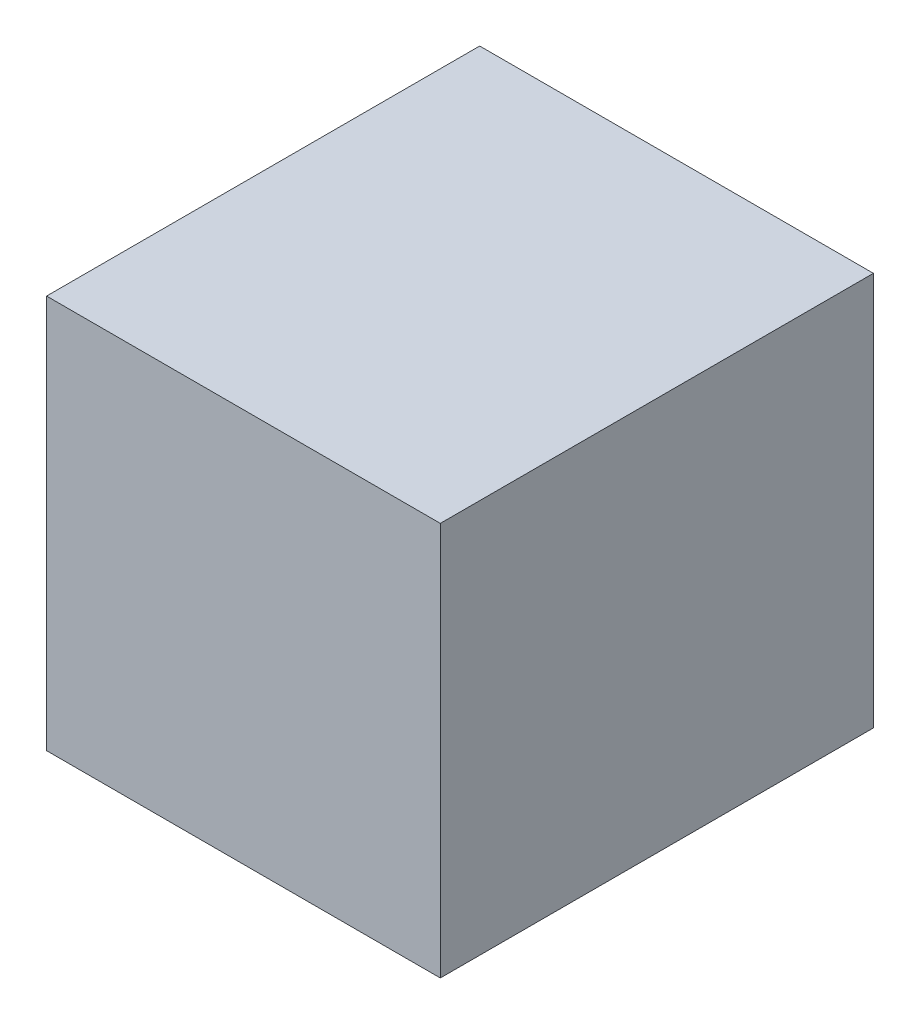
ISO-10303-21;
HEADER;
FILE_DESCRIPTION(('STEP AP214'),'2;1');
FILE_NAME('part.step','',(''),(''),'','','');
FILE_SCHEMA(('AUTOMOTIVE_DESIGN { 1 0 10303 214 1 1 1 1 }'));
ENDSEC;
DATA;
#1=APPLICATION_CONTEXT('core data for automotive mechanical design processes');
#2=APPLICATION_PROTOCOL_DEFINITION('international standard','automotive_design',2000,#1);
#3=PRODUCT_CONTEXT('',#1,'mechanical');
#4=PRODUCT('Part','Part','',(#3));
#5=PRODUCT_RELATED_PRODUCT_CATEGORY('part','',(#4));
#6=PRODUCT_DEFINITION_FORMATION('','',#4);
#7=PRODUCT_DEFINITION_CONTEXT('part definition',#1,'design');
#8=PRODUCT_DEFINITION('design','',#6,#7);
#9=PRODUCT_DEFINITION_SHAPE('','',#8);
#10=(LENGTH_UNIT() NAMED_UNIT(*) SI_UNIT(.MILLI.,.METRE.));
#11=(NAMED_UNIT(*) PLANE_ANGLE_UNIT() SI_UNIT($,.RADIAN.));
#12=(NAMED_UNIT(*) SI_UNIT($,.STERADIAN.) SOLID_ANGLE_UNIT());
#13=UNCERTAINTY_MEASURE_WITH_UNIT(LENGTH_MEASURE(1.E-05),#10,'distance_accuracy_value','');
#14=(GEOMETRIC_REPRESENTATION_CONTEXT(3) GLOBAL_UNCERTAINTY_ASSIGNED_CONTEXT((#13)) GLOBAL_UNIT_ASSIGNED_CONTEXT((#10,
#11,#12)) REPRESENTATION_CONTEXT('',''));
#15=CARTESIAN_POINT('',(0.,0.,0.));
#16=DIRECTION('',(0.,0.,1.));
#17=DIRECTION('',(1.,0.,0.));
#18=AXIS2_PLACEMENT_3D('',#15,#16,#17);
#19=CARTESIAN_POINT('',(200.,180.,-248.));
#20=DIRECTION('',(-1.,0.,0.));
#21=DIRECTION('',(0.,0.,1.));
#22=AXIS2_PLACEMENT_3D('',#19,#20,#21);
#23=PLANE('',#22);
#24=DIRECTION('',(0.,-1.,0.));
#25=VECTOR('',#24,1.);
#26=CARTESIAN_POINT('',(200.,180.,-138.));
#27=LINE('',#26,#25);
#28=CARTESIAN_POINT('',(200.,280.,-138.));
#29=VERTEX_POINT('',#28);
#30=CARTESIAN_POINT('',(200.,180.,-138.));
#31=VERTEX_POINT('',#30);
#32=EDGE_CURVE('E103',#29,#31,#27,.T.);
#33=ORIENTED_EDGE('',*,*,#32,.F.);
#34=DIRECTION('',(0.,0.,1.));
#35=VECTOR('',#34,1.);
#36=CARTESIAN_POINT('',(200.,280.,-248.));
#37=LINE('',#36,#35);
#38=CARTESIAN_POINT('',(200.,280.,-248.));
#39=VERTEX_POINT('',#38);
#40=EDGE_CURVE('E11',#39,#29,#37,.T.);
#41=ORIENTED_EDGE('',*,*,#40,.F.);
#42=DIRECTION('',(0.,-1.,0.));
#43=VECTOR('',#42,1.);
#44=CARTESIAN_POINT('',(200.,180.,-248.));
#45=LINE('',#44,#43);
#46=CARTESIAN_POINT('',(200.,180.,-248.));
#47=VERTEX_POINT('',#46);
#48=EDGE_CURVE('E97',#39,#47,#45,.T.);
#49=ORIENTED_EDGE('',*,*,#48,.T.);
#50=DIRECTION('',(0.,0.,1.));
#51=VECTOR('',#50,1.);
#52=CARTESIAN_POINT('',(200.,180.,-248.));
#53=LINE('',#52,#51);
#54=EDGE_CURVE('E42',#47,#31,#53,.T.);
#55=ORIENTED_EDGE('',*,*,#54,.T.);
#56=EDGE_LOOP('',(#33,#41,#49,#55));
#57=FACE_BOUND('',#56,.T.);
#58=ADVANCED_FACE('F39',(#57),#23,.T.);
#59=CARTESIAN_POINT('',(200.,280.,-248.));
#60=DIRECTION('',(0.,1.,0.));
#61=DIRECTION('',(0.,0.,1.));
#62=AXIS2_PLACEMENT_3D('',#59,#60,#61);
#63=PLANE('',#62);
#64=DIRECTION('',(-1.,0.,0.));
#65=VECTOR('',#64,1.);
#66=CARTESIAN_POINT('',(200.,280.,-138.));
#67=LINE('',#66,#65);
#68=CARTESIAN_POINT('',(300.,280.,-138.));
#69=VERTEX_POINT('',#68);
#70=EDGE_CURVE('E99',#69,#29,#67,.T.);
#71=ORIENTED_EDGE('',*,*,#70,.F.);
#72=DIRECTION('',(0.,0.,1.));
#73=VECTOR('',#72,1.);
#74=CARTESIAN_POINT('',(300.,280.,-248.));
#75=LINE('',#74,#73);
#76=CARTESIAN_POINT('',(300.,280.,-248.));
#77=VERTEX_POINT('',#76);
#78=EDGE_CURVE('E48',#77,#69,#75,.T.);
#79=ORIENTED_EDGE('',*,*,#78,.F.);
#80=DIRECTION('',(-1.,0.,0.));
#81=VECTOR('',#80,1.);
#82=CARTESIAN_POINT('',(200.,280.,-248.));
#83=LINE('',#82,#81);
#84=EDGE_CURVE('E94',#77,#39,#83,.T.);
#85=ORIENTED_EDGE('',*,*,#84,.T.);
#86=ORIENTED_EDGE('',*,*,#40,.T.);
#87=EDGE_LOOP('',(#71,#79,#85,#86));
#88=FACE_BOUND('',#87,.T.);
#89=ADVANCED_FACE('F113',(#88),#63,.T.);
#90=CARTESIAN_POINT('',(300.,180.,-248.));
#91=DIRECTION('',(1.,0.,0.));
#92=DIRECTION('',(0.,0.,-1.));
#93=AXIS2_PLACEMENT_3D('',#90,#91,#92);
#94=PLANE('',#93);
#95=DIRECTION('',(0.,1.,0.));
#96=VECTOR('',#95,1.);
#97=CARTESIAN_POINT('',(300.,180.,-138.));
#98=LINE('',#97,#96);
#99=CARTESIAN_POINT('',(300.,180.,-138.));
#100=VERTEX_POINT('',#99);
#101=EDGE_CURVE('E89',#100,#69,#98,.T.);
#102=ORIENTED_EDGE('',*,*,#101,.F.);
#103=DIRECTION('',(0.,0.,1.));
#104=VECTOR('',#103,1.);
#105=CARTESIAN_POINT('',(300.,180.,-248.));
#106=LINE('',#105,#104);
#107=CARTESIAN_POINT('',(300.,180.,-248.));
#108=VERTEX_POINT('',#107);
#109=EDGE_CURVE('E84',#108,#100,#106,.T.);
#110=ORIENTED_EDGE('',*,*,#109,.F.);
#111=DIRECTION('',(0.,1.,0.));
#112=VECTOR('',#111,1.);
#113=CARTESIAN_POINT('',(300.,180.,-248.));
#114=LINE('',#113,#112);
#115=EDGE_CURVE('E87',#108,#77,#114,.T.);
#116=ORIENTED_EDGE('',*,*,#115,.T.);
#117=ORIENTED_EDGE('',*,*,#78,.T.);
#118=EDGE_LOOP('',(#102,#110,#116,#117));
#119=FACE_BOUND('',#118,.T.);
#120=ADVANCED_FACE('F86',(#119),#94,.T.);
#121=CARTESIAN_POINT('',(200.,180.,-248.));
#122=DIRECTION('',(0.,-1.,0.));
#123=DIRECTION('',(0.,0.,-1.));
#124=AXIS2_PLACEMENT_3D('',#121,#122,#123);
#125=PLANE('',#124);
#126=DIRECTION('',(1.,0.,0.));
#127=VECTOR('',#126,1.);
#128=CARTESIAN_POINT('',(200.,180.,-138.));
#129=LINE('',#128,#127);
#130=EDGE_CURVE('E106',#31,#100,#129,.T.);
#131=ORIENTED_EDGE('',*,*,#130,.F.);
#132=ORIENTED_EDGE('',*,*,#54,.F.);
#133=DIRECTION('',(1.,0.,0.));
#134=VECTOR('',#133,1.);
#135=CARTESIAN_POINT('',(200.,180.,-248.));
#136=LINE('',#135,#134);
#137=EDGE_CURVE('E93',#47,#108,#136,.T.);
#138=ORIENTED_EDGE('',*,*,#137,.T.);
#139=ORIENTED_EDGE('',*,*,#109,.T.);
#140=EDGE_LOOP('',(#131,#132,#138,#139));
#141=FACE_BOUND('',#140,.T.);
#142=ADVANCED_FACE('F96',(#141),#125,.T.);
#143=CARTESIAN_POINT('',(0.,0.,-248.));
#144=DIRECTION('',(0.,0.,-1.));
#145=DIRECTION('',(-1.,0.,0.));
#146=AXIS2_PLACEMENT_3D('',#143,#144,#145);
#147=PLANE('',#146);
#148=ORIENTED_EDGE('',*,*,#48,.F.);
#149=ORIENTED_EDGE('',*,*,#84,.F.);
#150=ORIENTED_EDGE('',*,*,#115,.F.);
#151=ORIENTED_EDGE('',*,*,#137,.F.);
#152=EDGE_LOOP('',(#148,#149,#150,#151));
#153=FACE_BOUND('',#152,.T.);
#154=ADVANCED_FACE('F92',(#153),#147,.T.);
#155=CARTESIAN_POINT('',(0.,0.,-138.));
#156=DIRECTION('',(0.,0.,-1.));
#157=DIRECTION('',(-1.,0.,0.));
#158=AXIS2_PLACEMENT_3D('',#155,#156,#157);
#159=PLANE('',#158);
#160=ORIENTED_EDGE('',*,*,#32,.T.);
#161=ORIENTED_EDGE('',*,*,#130,.T.);
#162=ORIENTED_EDGE('',*,*,#101,.T.);
#163=ORIENTED_EDGE('',*,*,#70,.T.);
#164=EDGE_LOOP('',(#160,#161,#162,#163));
#165=FACE_BOUND('',#164,.T.);
#166=ADVANCED_FACE('F112',(#165),#159,.F.);
#167=CLOSED_SHELL('',(#58,#89,#120,#142,#154,#166));
#168=MANIFOLD_SOLID_BREP('B2',#167);
#169=ADVANCED_BREP_SHAPE_REPRESENTATION('',(#18,#168),#14);
#170=SHAPE_DEFINITION_REPRESENTATION(#9,#169);
ENDSEC;
END-ISO-10303-21;
